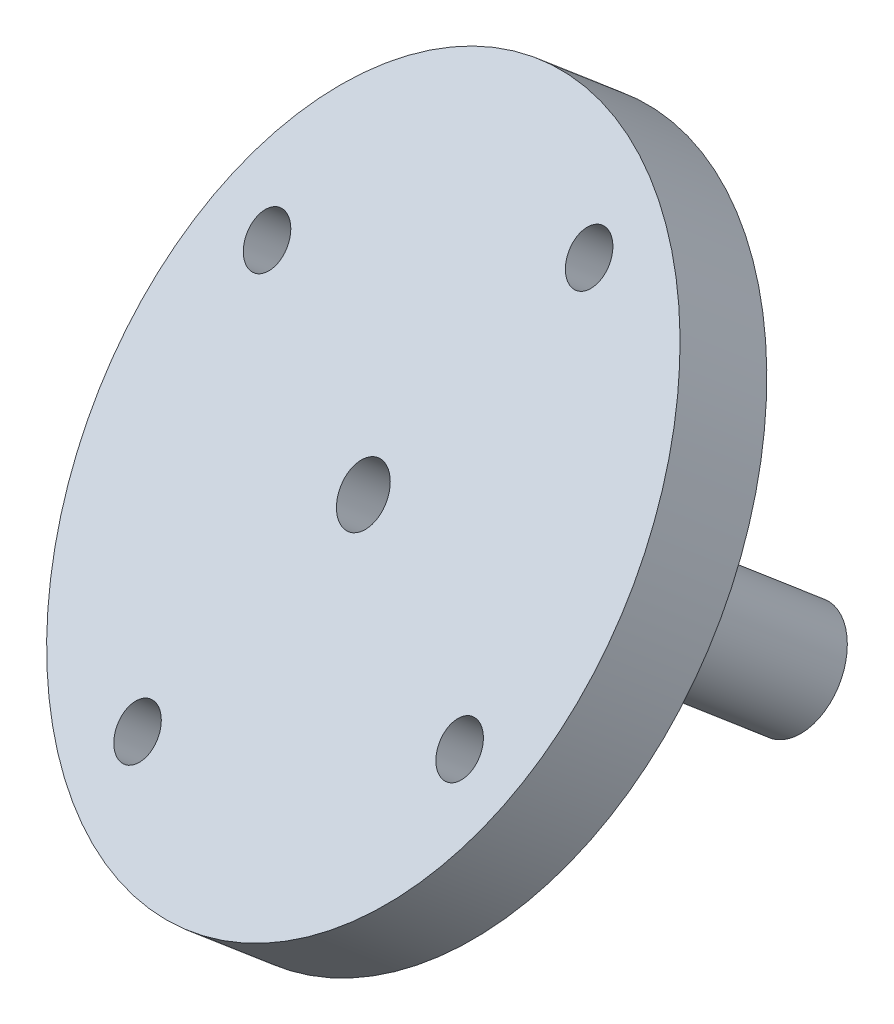
ISO-10303-21;
HEADER;
FILE_DESCRIPTION(('STEP AP214'),'2;1');
FILE_NAME('part.step','',(''),(''),'','','');
FILE_SCHEMA(('AUTOMOTIVE_DESIGN { 1 0 10303 214 1 1 1 1 }'));
ENDSEC;
DATA;
#1=APPLICATION_CONTEXT('core data for automotive mechanical design processes');
#2=APPLICATION_PROTOCOL_DEFINITION('international standard','automotive_design',2000,#1);
#3=PRODUCT_CONTEXT('',#1,'mechanical');
#4=PRODUCT('Part','Part','',(#3));
#5=PRODUCT_RELATED_PRODUCT_CATEGORY('part','',(#4));
#6=PRODUCT_DEFINITION_FORMATION('','',#4);
#7=PRODUCT_DEFINITION_CONTEXT('part definition',#1,'design');
#8=PRODUCT_DEFINITION('design','',#6,#7);
#9=PRODUCT_DEFINITION_SHAPE('','',#8);
#10=(LENGTH_UNIT() NAMED_UNIT(*) SI_UNIT(.MILLI.,.METRE.));
#11=(NAMED_UNIT(*) PLANE_ANGLE_UNIT() SI_UNIT($,.RADIAN.));
#12=(NAMED_UNIT(*) SI_UNIT($,.STERADIAN.) SOLID_ANGLE_UNIT());
#13=UNCERTAINTY_MEASURE_WITH_UNIT(LENGTH_MEASURE(1.E-05),#10,'distance_accuracy_value','');
#14=(GEOMETRIC_REPRESENTATION_CONTEXT(3) GLOBAL_UNCERTAINTY_ASSIGNED_CONTEXT((#13)) GLOBAL_UNIT_ASSIGNED_CONTEXT((#10,
#11,#12)) REPRESENTATION_CONTEXT('',''));
#15=CARTESIAN_POINT('',(0.,0.,0.));
#16=DIRECTION('',(0.,0.,1.));
#17=DIRECTION('',(1.,0.,0.));
#18=AXIS2_PLACEMENT_3D('',#15,#16,#17);
#19=CARTESIAN_POINT('',(1047.81587024624,-1947.43974041424,-1845.1702025397));
#20=DIRECTION('',(0.293478154649481,-0.591496617929711,-0.751000881305241));
#21=DIRECTION('',(0.,0.785593895649608,-0.618742459443405));
#22=AXIS2_PLACEMENT_3D('',#19,#20,#21);
#23=PLANE('',#22);
#24=CARTESIAN_POINT('',(1034.54827026486,-1944.53817459751,-1852.64025652514));
#25=DIRECTION('',(0.293478154649481,-0.591496617929711,-0.751000881305241));
#26=DIRECTION('',(0.,0.785593895649608,-0.618742459443405));
#27=AXIS2_PLACEMENT_3D('',#24,#25,#26);
#28=CIRCLE('',#27,1.49999999999977);
#29=CARTESIAN_POINT('',(1034.54827026486,-1943.35978375404,-1853.5683702143));
#30=VERTEX_POINT('',#29);
#31=EDGE_CURVE('E66',#30,#30,#28,.T.);
#32=ORIENTED_EDGE('',*,*,#31,.F.);
#33=EDGE_LOOP('',(#32));
#34=FACE_BOUND('',#33,.T.);
#35=CARTESIAN_POINT('',(1061.08347022762,-1950.34130623097,-1837.70014855427));
#36=DIRECTION('',(0.293478154649481,-0.591496617929711,-0.751000881305241));
#37=DIRECTION('',(0.,0.785593895649608,-0.618742459443405));
#38=AXIS2_PLACEMENT_3D('',#35,#36,#37);
#39=CIRCLE('',#38,1.50000000000015);
#40=CARTESIAN_POINT('',(1061.08347022762,-1949.16291538749,-1838.62826224344));
#41=VERTEX_POINT('',#40);
#42=EDGE_CURVE('E56',#41,#41,#39,.T.);
#43=ORIENTED_EDGE('',*,*,#42,.F.);
#44=EDGE_LOOP('',(#43));
#45=FACE_BOUND('',#44,.T.);
#46=CARTESIAN_POINT('',(1041.21828009258,-1959.59601735184,-1838.17400820416));
#47=DIRECTION('',(0.293478154649481,-0.591496617929711,-0.751000881305241));
#48=DIRECTION('',(0.,0.785593895649608,-0.618742459443405));
#49=AXIS2_PLACEMENT_3D('',#46,#47,#48);
#50=CIRCLE('',#49,1.4999999999999);
#51=CARTESIAN_POINT('',(1041.21828009258,-1958.41762650836,-1839.10212189333));
#52=VERTEX_POINT('',#51);
#53=EDGE_CURVE('E46',#52,#52,#50,.T.);
#54=ORIENTED_EDGE('',*,*,#53,.F.);
#55=EDGE_LOOP('',(#54));
#56=FACE_BOUND('',#55,.T.);
#57=CARTESIAN_POINT('',(1047.81587024624,-1947.43974041424,-1845.1702025397));
#58=DIRECTION('',(0.293478154649481,-0.591496617929711,-0.751000881305241));
#59=DIRECTION('',(0.,0.785593895649608,-0.618742459443405));
#60=AXIS2_PLACEMENT_3D('',#57,#58,#59);
#61=CIRCLE('',#60,20.);
#62=CARTESIAN_POINT('',(1047.81587024624,-1931.72786250125,-1857.54505172857));
#63=VERTEX_POINT('',#62);
#64=EDGE_CURVE('E10',#63,#63,#61,.T.);
#65=ORIENTED_EDGE('',*,*,#64,.T.);
#66=EDGE_LOOP('',(#65));
#67=FACE_BOUND('',#66,.T.);
#68=CARTESIAN_POINT('',(1054.4134603999,-1935.28346347664,-1852.16639687525));
#69=DIRECTION('',(0.293478154649481,-0.591496617929711,-0.751000881305241));
#70=DIRECTION('',(0.,0.785593895649608,-0.618742459443405));
#71=AXIS2_PLACEMENT_3D('',#68,#69,#70);
#72=CIRCLE('',#71,1.5);
#73=CARTESIAN_POINT('',(1054.4134603999,-1934.10507263317,-1853.09451056441));
#74=VERTEX_POINT('',#73);
#75=EDGE_CURVE('E60',#74,#74,#72,.T.);
#76=ORIENTED_EDGE('',*,*,#75,.F.);
#77=EDGE_LOOP('',(#76));
#78=FACE_BOUND('',#77,.T.);
#79=CARTESIAN_POINT('',(1047.81587024624,-1947.43974041424,-1845.1702025397));
#80=DIRECTION('',(0.293478154649481,-0.591496617929711,-0.751000881305241));
#81=DIRECTION('',(0.,0.785593895649608,-0.618742459443405));
#82=AXIS2_PLACEMENT_3D('',#79,#80,#81);
#83=CIRCLE('',#82,3.17500000000004);
#84=CARTESIAN_POINT('',(1047.81587024624,-1944.94547979555,-1847.13470984844));
#85=VERTEX_POINT('',#84);
#86=EDGE_CURVE('E75',#85,#85,#83,.T.);
#87=ORIENTED_EDGE('',*,*,#86,.F.);
#88=EDGE_LOOP('',(#87));
#89=FACE_BOUND('',#88,.T.);
#90=ADVANCED_FACE('F35',(#34,#45,#56,#67,#78,#89),#23,.T.);
#91=CARTESIAN_POINT('',(1046.34847947299,-1944.48225732459,-1841.41519813318));
#92=DIRECTION('',(0.293478154649481,-0.591496617929711,-0.751000881305241));
#93=DIRECTION('',(0.,0.785593895649608,-0.618742459443405));
#94=AXIS2_PLACEMENT_3D('',#91,#92,#93);
#95=PLANE('',#94);
#96=CARTESIAN_POINT('',(1046.34847947299,-1944.48225732459,-1841.41519813318));
#97=DIRECTION('',(0.293478154649481,-0.591496617929711,-0.751000881305241));
#98=DIRECTION('',(0.,0.785593895649608,-0.618742459443405));
#99=AXIS2_PLACEMENT_3D('',#96,#97,#98);
#100=CIRCLE('',#99,20.);
#101=CARTESIAN_POINT('',(1046.34847947299,-1928.7703794116,-1853.79004732205));
#102=VERTEX_POINT('',#101);
#103=EDGE_CURVE('E39',#102,#102,#100,.T.);
#104=ORIENTED_EDGE('',*,*,#103,.F.);
#105=EDGE_LOOP('',(#104));
#106=FACE_BOUND('',#105,.T.);
#107=CARTESIAN_POINT('',(1039.75088931933,-1956.63853426219,-1834.41900379763));
#108=DIRECTION('',(0.293478154649481,-0.591496617929711,-0.751000881305241));
#109=DIRECTION('',(0.,0.785593895649608,-0.618742459443405));
#110=AXIS2_PLACEMENT_3D('',#107,#108,#109);
#111=CIRCLE('',#110,1.4999999999999);
#112=CARTESIAN_POINT('',(1039.75088931933,-1955.46014341871,-1835.3471174868));
#113=VERTEX_POINT('',#112);
#114=EDGE_CURVE('E48',#113,#113,#111,.T.);
#115=ORIENTED_EDGE('',*,*,#114,.T.);
#116=EDGE_LOOP('',(#115));
#117=FACE_BOUND('',#116,.T.);
#118=CARTESIAN_POINT('',(1046.34847947299,-1944.48225732459,-1841.41519813318));
#119=DIRECTION('',(0.293478154649481,-0.591496617929711,-0.751000881305241));
#120=DIRECTION('',(0.,0.785593895649608,-0.618742459443405));
#121=AXIS2_PLACEMENT_3D('',#118,#119,#120);
#122=CIRCLE('',#121,1.70000000000011);
#123=CARTESIAN_POINT('',(1046.34847947299,-1943.14674770199,-1842.46706031423));
#124=VERTEX_POINT('',#123);
#125=EDGE_CURVE('E51',#124,#124,#122,.T.);
#126=ORIENTED_EDGE('',*,*,#125,.T.);
#127=EDGE_LOOP('',(#126));
#128=FACE_BOUND('',#127,.T.);
#129=CARTESIAN_POINT('',(1059.61607945437,-1947.38382314132,-1833.94514414775));
#130=DIRECTION('',(0.293478154649481,-0.591496617929711,-0.751000881305241));
#131=DIRECTION('',(0.,0.785593895649608,-0.618742459443405));
#132=AXIS2_PLACEMENT_3D('',#129,#130,#131);
#133=CIRCLE('',#132,1.50000000000015);
#134=CARTESIAN_POINT('',(1059.61607945437,-1946.20543229784,-1834.87325783691));
#135=VERTEX_POINT('',#134);
#136=EDGE_CURVE('E57',#135,#135,#133,.T.);
#137=ORIENTED_EDGE('',*,*,#136,.T.);
#138=EDGE_LOOP('',(#137));
#139=FACE_BOUND('',#138,.T.);
#140=CARTESIAN_POINT('',(1052.94606962666,-1932.32598038699,-1848.41139246872));
#141=DIRECTION('',(0.293478154649481,-0.591496617929711,-0.751000881305241));
#142=DIRECTION('',(0.,0.785593895649608,-0.618742459443405));
#143=AXIS2_PLACEMENT_3D('',#140,#141,#142);
#144=CIRCLE('',#143,1.5);
#145=CARTESIAN_POINT('',(1052.94606962666,-1931.14758954352,-1849.33950615789));
#146=VERTEX_POINT('',#145);
#147=EDGE_CURVE('E63',#146,#146,#144,.T.);
#148=ORIENTED_EDGE('',*,*,#147,.T.);
#149=EDGE_LOOP('',(#148));
#150=FACE_BOUND('',#149,.T.);
#151=CARTESIAN_POINT('',(1033.08087949161,-1941.58069150786,-1848.88525211861));
#152=DIRECTION('',(0.293478154649481,-0.591496617929711,-0.751000881305241));
#153=DIRECTION('',(0.,0.785593895649608,-0.618742459443405));
#154=AXIS2_PLACEMENT_3D('',#151,#152,#153);
#155=CIRCLE('',#154,1.49999999999977);
#156=CARTESIAN_POINT('',(1033.08087949161,-1940.40230066439,-1849.81336580778));
#157=VERTEX_POINT('',#156);
#158=EDGE_CURVE('E69',#157,#157,#155,.T.);
#159=ORIENTED_EDGE('',*,*,#158,.T.);
#160=EDGE_LOOP('',(#159));
#161=FACE_BOUND('',#160,.T.);
#162=ADVANCED_FACE('F102',(#106,#117,#128,#139,#150,#161),#95,.F.);
#163=CARTESIAN_POINT('',(1047.81587024624,-1947.43974041424,-1845.1702025397));
#164=DIRECTION('',(-0.293478154649481,0.591496617929711,0.751000881305241));
#165=DIRECTION('',(0.,-0.785593895649608,0.618742459443405));
#166=AXIS2_PLACEMENT_3D('',#163,#164,#165);
#167=CYLINDRICAL_SURFACE('',#166,20.);
#168=ORIENTED_EDGE('',*,*,#64,.F.);
#169=EDGE_LOOP('',(#168));
#170=FACE_BOUND('',#169,.T.);
#171=ORIENTED_EDGE('',*,*,#103,.T.);
#172=EDGE_LOOP('',(#171));
#173=FACE_BOUND('',#172,.T.);
#174=ADVANCED_FACE('F37',(#170,#173),#167,.T.);
#175=CARTESIAN_POINT('',(1041.21828009258,-1959.59601735184,-1838.17400820416));
#176=DIRECTION('',(-0.293478154649481,0.591496617929711,0.751000881305241));
#177=DIRECTION('',(0.,-0.785593895649608,0.618742459443405));
#178=AXIS2_PLACEMENT_3D('',#175,#176,#177);
#179=CYLINDRICAL_SURFACE('',#178,1.4999999999999);
#180=ORIENTED_EDGE('',*,*,#53,.T.);
#181=EDGE_LOOP('',(#180));
#182=FACE_BOUND('',#181,.T.);
#183=ORIENTED_EDGE('',*,*,#114,.F.);
#184=EDGE_LOOP('',(#183));
#185=FACE_BOUND('',#184,.T.);
#186=ADVANCED_FACE('F112',(#182,#185),#179,.F.);
#187=CARTESIAN_POINT('',(1047.81587024624,-1947.43974041424,-1845.1702025397));
#188=DIRECTION('',(-0.293478154649481,0.591496617929711,0.751000881305241));
#189=DIRECTION('',(0.,-0.785593895649608,0.618742459443405));
#190=AXIS2_PLACEMENT_3D('',#187,#188,#189);
#191=CYLINDRICAL_SURFACE('',#190,1.70000000000011);
#192=ORIENTED_EDGE('',*,*,#125,.F.);
#193=EDGE_LOOP('',(#192));
#194=FACE_BOUND('',#193,.T.);
#195=CARTESIAN_POINT('',(1053.68543333923,-1959.26967277283,-1860.19022016581));
#196=DIRECTION('',(0.293478154649481,-0.591496617929711,-0.751000881305241));
#197=DIRECTION('',(0.,0.785593895649608,-0.618742459443405));
#198=AXIS2_PLACEMENT_3D('',#195,#196,#197);
#199=CIRCLE('',#198,1.70000000000048);
#200=CARTESIAN_POINT('',(1053.68543333923,-1957.93416315023,-1861.24208234686));
#201=VERTEX_POINT('',#200);
#202=EDGE_CURVE('E78',#201,#201,#199,.T.);
#203=ORIENTED_EDGE('',*,*,#202,.T.);
#204=EDGE_LOOP('',(#203));
#205=FACE_BOUND('',#204,.T.);
#206=ADVANCED_FACE('F84',(#194,#205),#191,.F.);
#207=CARTESIAN_POINT('',(1061.08347022762,-1950.34130623097,-1837.70014855427));
#208=DIRECTION('',(-0.293478154649481,0.591496617929711,0.751000881305241));
#209=DIRECTION('',(0.,-0.785593895649608,0.618742459443405));
#210=AXIS2_PLACEMENT_3D('',#207,#208,#209);
#211=CYLINDRICAL_SURFACE('',#210,1.50000000000015);
#212=ORIENTED_EDGE('',*,*,#42,.T.);
#213=EDGE_LOOP('',(#212));
#214=FACE_BOUND('',#213,.T.);
#215=ORIENTED_EDGE('',*,*,#136,.F.);
#216=EDGE_LOOP('',(#215));
#217=FACE_BOUND('',#216,.T.);
#218=ADVANCED_FACE('F118',(#214,#217),#211,.F.);
#219=CARTESIAN_POINT('',(1054.4134603999,-1935.28346347664,-1852.16639687525));
#220=DIRECTION('',(-0.293478154649481,0.591496617929711,0.751000881305241));
#221=DIRECTION('',(0.,-0.785593895649608,0.618742459443405));
#222=AXIS2_PLACEMENT_3D('',#219,#220,#221);
#223=CYLINDRICAL_SURFACE('',#222,1.5);
#224=ORIENTED_EDGE('',*,*,#75,.T.);
#225=EDGE_LOOP('',(#224));
#226=FACE_BOUND('',#225,.T.);
#227=ORIENTED_EDGE('',*,*,#147,.F.);
#228=EDGE_LOOP('',(#227));
#229=FACE_BOUND('',#228,.T.);
#230=ADVANCED_FACE('F98',(#226,#229),#223,.F.);
#231=CARTESIAN_POINT('',(1034.54827026486,-1944.53817459751,-1852.64025652514));
#232=DIRECTION('',(-0.293478154649481,0.591496617929711,0.751000881305241));
#233=DIRECTION('',(0.,-0.785593895649608,0.618742459443405));
#234=AXIS2_PLACEMENT_3D('',#231,#232,#233);
#235=CYLINDRICAL_SURFACE('',#234,1.49999999999977);
#236=ORIENTED_EDGE('',*,*,#31,.T.);
#237=EDGE_LOOP('',(#236));
#238=FACE_BOUND('',#237,.T.);
#239=ORIENTED_EDGE('',*,*,#158,.F.);
#240=EDGE_LOOP('',(#239));
#241=FACE_BOUND('',#240,.T.);
#242=ADVANCED_FACE('F89',(#238,#241),#235,.F.);
#243=CARTESIAN_POINT('',(1053.68543333923,-1959.26967277283,-1860.19022016581));
#244=DIRECTION('',(0.293478154649481,-0.591496617929711,-0.751000881305241));
#245=DIRECTION('',(0.,0.785593895649608,-0.618742459443405));
#246=AXIS2_PLACEMENT_3D('',#243,#244,#245);
#247=PLANE('',#246);
#248=CARTESIAN_POINT('',(1053.68543333923,-1959.26967277283,-1860.19022016581));
#249=DIRECTION('',(0.293478154649481,-0.591496617929711,-0.751000881305241));
#250=DIRECTION('',(0.,0.785593895649608,-0.618742459443405));
#251=AXIS2_PLACEMENT_3D('',#248,#249,#250);
#252=CIRCLE('',#251,3.17500000000004);
#253=CARTESIAN_POINT('',(1053.68543333923,-1956.77541215415,-1862.15472747454));
#254=VERTEX_POINT('',#253);
#255=EDGE_CURVE('E72',#254,#254,#252,.T.);
#256=ORIENTED_EDGE('',*,*,#255,.T.);
#257=EDGE_LOOP('',(#256));
#258=FACE_BOUND('',#257,.T.);
#259=ORIENTED_EDGE('',*,*,#202,.F.);
#260=EDGE_LOOP('',(#259));
#261=FACE_BOUND('',#260,.T.);
#262=ADVANCED_FACE('F86',(#258,#261),#247,.T.);
#263=CARTESIAN_POINT('',(1053.68543333923,-1959.26967277283,-1860.19022016581));
#264=DIRECTION('',(-0.293478154649481,0.591496617929711,0.751000881305241));
#265=DIRECTION('',(0.,-0.785593895649608,0.618742459443405));
#266=AXIS2_PLACEMENT_3D('',#263,#264,#265);
#267=CYLINDRICAL_SURFACE('',#266,3.17500000000004);
#268=ORIENTED_EDGE('',*,*,#255,.F.);
#269=EDGE_LOOP('',(#268));
#270=FACE_BOUND('',#269,.T.);
#271=ORIENTED_EDGE('',*,*,#86,.T.);
#272=EDGE_LOOP('',(#271));
#273=FACE_BOUND('',#272,.T.);
#274=ADVANCED_FACE('F88',(#270,#273),#267,.T.);
#275=CLOSED_SHELL('',(#90,#162,#174,#186,#206,#218,#230,#242,#262,#274));
#276=MANIFOLD_SOLID_BREP('B2',#275);
#277=ADVANCED_BREP_SHAPE_REPRESENTATION('',(#18,#276),#14);
#278=SHAPE_DEFINITION_REPRESENTATION(#9,#277);
ENDSEC;
END-ISO-10303-21;
